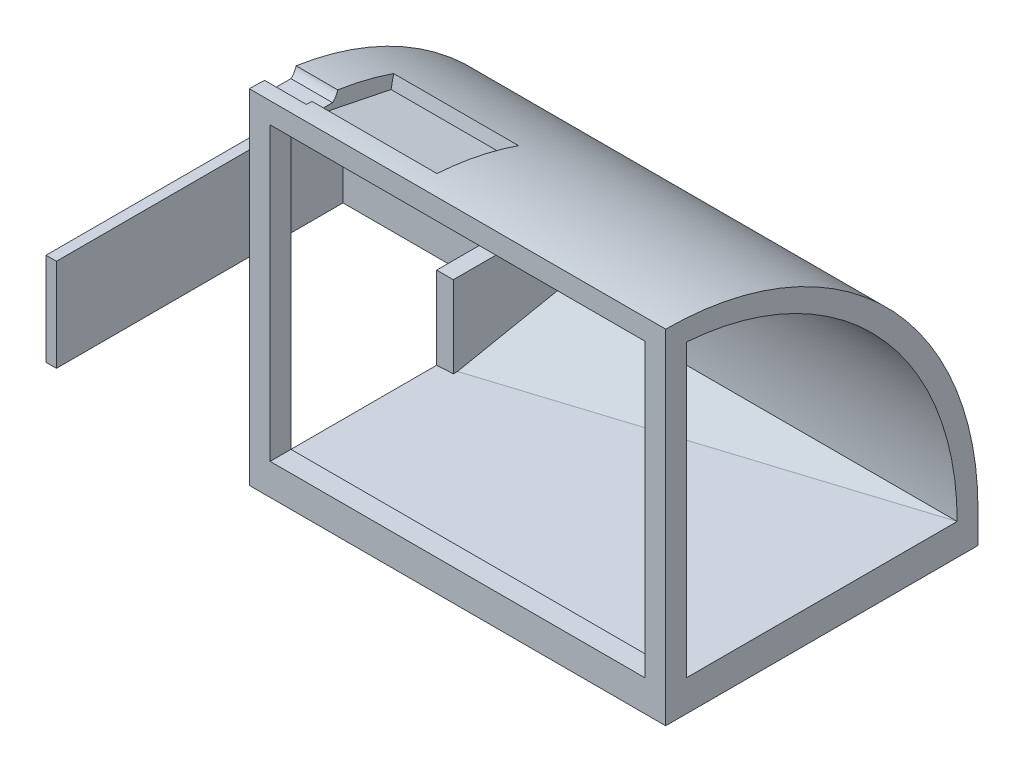
ISO-10303-21;
HEADER;
FILE_DESCRIPTION(('STEP AP214'),'2;1');
FILE_NAME('part.step','',(''),(''),'','','');
FILE_SCHEMA(('AUTOMOTIVE_DESIGN { 1 0 10303 214 1 1 1 1 }'));
ENDSEC;
DATA;
#1=APPLICATION_CONTEXT('core data for automotive mechanical design processes');
#2=APPLICATION_PROTOCOL_DEFINITION('international standard','automotive_design',2000,#1);
#3=PRODUCT_CONTEXT('',#1,'mechanical');
#4=PRODUCT('Part','Part','',(#3));
#5=PRODUCT_RELATED_PRODUCT_CATEGORY('part','',(#4));
#6=PRODUCT_DEFINITION_FORMATION('','',#4);
#7=PRODUCT_DEFINITION_CONTEXT('part definition',#1,'design');
#8=PRODUCT_DEFINITION('design','',#6,#7);
#9=PRODUCT_DEFINITION_SHAPE('','',#8);
#10=(LENGTH_UNIT() NAMED_UNIT(*) SI_UNIT(.MILLI.,.METRE.));
#11=(NAMED_UNIT(*) PLANE_ANGLE_UNIT() SI_UNIT($,.RADIAN.));
#12=(NAMED_UNIT(*) SI_UNIT($,.STERADIAN.) SOLID_ANGLE_UNIT());
#13=UNCERTAINTY_MEASURE_WITH_UNIT(LENGTH_MEASURE(1.E-05),#10,'distance_accuracy_value','');
#14=(GEOMETRIC_REPRESENTATION_CONTEXT(3) GLOBAL_UNCERTAINTY_ASSIGNED_CONTEXT((#13)) GLOBAL_UNIT_ASSIGNED_CONTEXT((#10,
#11,#12)) REPRESENTATION_CONTEXT('',''));
#15=CARTESIAN_POINT('',(0.,0.,0.));
#16=DIRECTION('',(0.,0.,1.));
#17=DIRECTION('',(1.,0.,0.));
#18=AXIS2_PLACEMENT_3D('',#15,#16,#17);
#19=CARTESIAN_POINT('',(-100.,0.,75.));
#20=DIRECTION('',(-1.,0.,0.));
#21=DIRECTION('',(0.,0.,1.));
#22=AXIS2_PLACEMENT_3D('',#19,#20,#21);
#23=CYLINDRICAL_SURFACE('',#22,140.);
#24=CARTESIAN_POINT('',(-195.,0.,75.));
#25=DIRECTION('',(-1.,0.,0.));
#26=DIRECTION('',(0.,0.,1.));
#27=AXIS2_PLACEMENT_3D('',#24,#25,#26);
#28=CIRCLE('',#27,140.);
#29=CARTESIAN_POINT('',(-195.,29.5585297831051,-61.8440474301359));
#30=VERTEX_POINT('',#29);
#31=CARTESIAN_POINT('',(-195.,0.,-65.));
#32=VERTEX_POINT('',#31);
#33=EDGE_CURVE('E434',#30,#32,#28,.T.);
#34=ORIENTED_EDGE('',*,*,#33,.T.);
#35=DIRECTION('',(1.,0.,0.));
#36=VECTOR('',#35,1.);
#37=CARTESIAN_POINT('',(-200.,0.,-65.));
#38=LINE('',#37,#36);
#39=CARTESIAN_POINT('',(-100.,0.,-65.));
#40=VERTEX_POINT('',#39);
#41=EDGE_CURVE('E215',#32,#40,#38,.T.);
#42=ORIENTED_EDGE('',*,*,#41,.T.);
#43=CARTESIAN_POINT('',(-100.,0.,75.));
#44=DIRECTION('',(-1.,0.,0.));
#45=DIRECTION('',(0.,0.,1.));
#46=AXIS2_PLACEMENT_3D('',#43,#44,#45);
#47=CIRCLE('',#46,140.);
#48=CARTESIAN_POINT('',(-100.,29.5585297831051,-61.8440474301359));
#49=VERTEX_POINT('',#48);
#50=EDGE_CURVE('E466',#49,#40,#47,.T.);
#51=ORIENTED_EDGE('',*,*,#50,.F.);
#52=DIRECTION('',(1.,0.,0.));
#53=VECTOR('',#52,1.);
#54=CARTESIAN_POINT('',(-200.,29.5585297831051,-61.8440474301359));
#55=LINE('',#54,#53);
#56=EDGE_CURVE('E230',#30,#49,#55,.T.);
#57=ORIENTED_EDGE('',*,*,#56,.F.);
#58=EDGE_LOOP('',(#34,#42,#51,#57));
#59=FACE_BOUND('',#58,.T.);
#60=ADVANCED_FACE('F211',(#59),#23,.F.);
#61=CARTESIAN_POINT('',(-200.,0.,-65.));
#62=DIRECTION('',(0.,0.,1.));
#63=DIRECTION('',(1.,0.,0.));
#64=AXIS2_PLACEMENT_3D('',#61,#62,#63);
#65=PLANE('',#64);
#66=ORIENTED_EDGE('',*,*,#41,.F.);
#67=DIRECTION('',(0.,-1.,0.));
#68=VECTOR('',#67,1.);
#69=CARTESIAN_POINT('',(-195.,0.,-65.));
#70=LINE('',#69,#68);
#71=CARTESIAN_POINT('',(-195.,-15.,-65.));
#72=VERTEX_POINT('',#71);
#73=EDGE_CURVE('E238',#32,#72,#70,.T.);
#74=ORIENTED_EDGE('',*,*,#73,.T.);
#75=DIRECTION('',(1.,0.,0.));
#76=VECTOR('',#75,1.);
#77=CARTESIAN_POINT('',(-200.,-15.,-65.));
#78=LINE('',#77,#76);
#79=CARTESIAN_POINT('',(-100.,-15.,-65.));
#80=VERTEX_POINT('',#79);
#81=EDGE_CURVE('E430',#72,#80,#78,.T.);
#82=ORIENTED_EDGE('',*,*,#81,.T.);
#83=DIRECTION('',(0.,-1.,0.));
#84=VECTOR('',#83,1.);
#85=CARTESIAN_POINT('',(-100.,0.,-65.));
#86=LINE('',#85,#84);
#87=EDGE_CURVE('E474',#40,#80,#86,.T.);
#88=ORIENTED_EDGE('',*,*,#87,.F.);
#89=EDGE_LOOP('',(#66,#74,#82,#88));
#90=FACE_BOUND('',#89,.T.);
#91=ADVANCED_FACE('F553',(#90),#65,.T.);
#92=CARTESIAN_POINT('',(-92.,0.,75.));
#93=DIRECTION('',(-1.,0.,0.));
#94=DIRECTION('',(0.,0.,1.));
#95=AXIS2_PLACEMENT_3D('',#92,#93,#94);
#96=CIRCLE('',#95,140.);
#97=CARTESIAN_POINT('',(-92.,29.5585297831051,-61.8440474301359));
#98=VERTEX_POINT('',#97);
#99=CARTESIAN_POINT('',(-92.,0.,-65.));
#100=VERTEX_POINT('',#99);
#101=EDGE_CURVE('E449',#98,#100,#96,.T.);
#102=ORIENTED_EDGE('',*,*,#101,.T.);
#103=CARTESIAN_POINT('',(-92.,0.,-65.));
#104=DIRECTION('',(1.,0.,0.));
#105=VECTOR('',#104,1.);
#106=LINE('',#103,#105);
#107=CARTESIAN_POINT('',(100.,0.,-65.));
#108=VERTEX_POINT('',#107);
#109=EDGE_CURVE('E576',#100,#108,#106,.T.);
#110=ORIENTED_EDGE('',*,*,#109,.T.);
#111=CARTESIAN_POINT('',(100.,0.,75.));
#112=DIRECTION('',(-1.,0.,0.));
#113=DIRECTION('',(0.,0.,1.));
#114=AXIS2_PLACEMENT_3D('',#111,#112,#113);
#115=CIRCLE('',#114,140.);
#116=CARTESIAN_POINT('',(100.,139.642400437689,65.));
#117=VERTEX_POINT('',#116);
#118=EDGE_CURVE('E723',#117,#108,#115,.T.);
#119=ORIENTED_EDGE('',*,*,#118,.F.);
#120=DIRECTION('',(-1.,0.,0.));
#121=VECTOR('',#120,1.);
#122=CARTESIAN_POINT('',(-100.,139.642400437689,65.));
#123=LINE('',#122,#121);
#124=CARTESIAN_POINT('',(90.,139.642400437689,65.));
#125=VERTEX_POINT('',#124);
#126=EDGE_CURVE('E682',#117,#125,#123,.T.);
#127=ORIENTED_EDGE('',*,*,#126,.T.);
#128=CARTESIAN_POINT('',(90.,0.,75.));
#129=DIRECTION('',(-1.,0.,0.));
#130=DIRECTION('',(0.,0.,1.));
#131=AXIS2_PLACEMENT_3D('',#128,#129,#130);
#132=CIRCLE('',#131,140.);
#133=CARTESIAN_POINT('',(90.,140.,75.0000000000005));
#134=VERTEX_POINT('',#133);
#135=EDGE_CURVE('E679',#134,#125,#132,.T.);
#136=ORIENTED_EDGE('',*,*,#135,.F.);
#137=DIRECTION('',(1.,0.,0.));
#138=VECTOR('',#137,1.);
#139=CARTESIAN_POINT('',(0.,140.,75.0000000000005));
#140=LINE('',#139,#138);
#141=CARTESIAN_POINT('',(-90.,140.,75.0000000000005));
#142=VERTEX_POINT('',#141);
#143=EDGE_CURVE('E705',#142,#134,#140,.T.);
#144=ORIENTED_EDGE('',*,*,#143,.F.);
#145=CARTESIAN_POINT('',(-90.,0.,75.));
#146=DIRECTION('',(-1.,0.,0.));
#147=DIRECTION('',(0.,0.,1.));
#148=AXIS2_PLACEMENT_3D('',#145,#146,#147);
#149=CIRCLE('',#148,140.);
#150=CARTESIAN_POINT('',(-90.,139.642400437689,65.0000000000001));
#151=VERTEX_POINT('',#150);
#152=EDGE_CURVE('E696',#142,#151,#149,.T.);
#153=ORIENTED_EDGE('',*,*,#152,.T.);
#154=DIRECTION('',(-1.,0.,0.));
#155=VECTOR('',#154,1.);
#156=CARTESIAN_POINT('',(-100.,139.642400437689,65.0000000000001));
#157=LINE('',#156,#155);
#158=CARTESIAN_POINT('',(-100.,139.642400437689,65.0000000000001));
#159=VERTEX_POINT('',#158);
#160=EDGE_CURVE('E701',#159,#151,#157,.F.);
#161=ORIENTED_EDGE('',*,*,#160,.F.);
#162=CARTESIAN_POINT('',(-100.,0.,75.));
#163=DIRECTION('',(-1.,0.,0.));
#164=DIRECTION('',(0.,0.,1.));
#165=AXIS2_PLACEMENT_3D('',#162,#163,#164);
#166=CIRCLE('',#165,140.);
#167=EDGE_CURVE('E713',#159,#49,#166,.T.);
#168=ORIENTED_EDGE('',*,*,#167,.T.);
#169=DIRECTION('',(-1.,0.,0.));
#170=VECTOR('',#169,1.);
#171=CARTESIAN_POINT('',(-92.,29.5585297831051,-61.8440474301359));
#172=LINE('',#171,#170);
#173=EDGE_CURVE('E461',#98,#49,#172,.T.);
#174=ORIENTED_EDGE('',*,*,#173,.F.);
#175=EDGE_LOOP('',(#102,#110,#119,#127,#136,#144,#153,#161,#168,#174));
#176=FACE_BOUND('',#175,.T.);
#177=ADVANCED_FACE('F554',(#176),#23,.F.);
#178=CARTESIAN_POINT('',(-100.,0.,-65.));
#179=DIRECTION('',(0.,-0.98058067569092,-0.196116135138184));
#180=DIRECTION('',(1.,0.,0.));
#181=AXIS2_PLACEMENT_3D('',#178,#179,#180);
#182=PLANE('',#181);
#183=DIRECTION('',(0.,-0.196116135138184,0.98058067569092));
#184=VECTOR('',#183,1.);
#185=CARTESIAN_POINT('',(-92.,-12.5,-2.49999999999998));
#186=LINE('',#185,#184);
#187=CARTESIAN_POINT('',(-92.,-9.60000000000001,-16.9999999999999));
#188=VERTEX_POINT('',#187);
#189=EDGE_CURVE('E456',#100,#188,#186,.T.);
#190=ORIENTED_EDGE('',*,*,#189,.T.);
#191=DIRECTION('',(-0.969003166223018,-0.048450158311151,0.242250791555755));
#192=VECTOR('',#191,1.);
#193=CARTESIAN_POINT('',(0.,-5.,-40.));
#194=LINE('',#193,#192);
#195=EDGE_CURVE('E509',#108,#188,#194,.T.);
#196=ORIENTED_EDGE('',*,*,#195,.F.);
#197=ORIENTED_EDGE('',*,*,#109,.F.);
#198=EDGE_LOOP('',(#190,#196,#197));
#199=FACE_BOUND('',#198,.T.);
#200=ADVANCED_FACE('F594',(#199),#182,.F.);
#201=CARTESIAN_POINT('',(-100.,0.,75.));
#202=DIRECTION('',(-1.,0.,0.));
#203=DIRECTION('',(0.,0.,1.));
#204=AXIS2_PLACEMENT_3D('',#201,#202,#203);
#205=CYLINDRICAL_SURFACE('',#204,150.);
#206=DIRECTION('',(-1.,0.,0.));
#207=VECTOR('',#206,1.);
#208=CARTESIAN_POINT('',(-90.,148.308101078321,52.5343116165472));
#209=LINE('',#208,#207);
#210=CARTESIAN_POINT('',(-80.,148.308101078321,52.5343116165472));
#211=VERTEX_POINT('',#210);
#212=CARTESIAN_POINT('',(-100.,148.308101078321,52.5343116165472));
#213=VERTEX_POINT('',#212);
#214=EDGE_CURVE('E662',#211,#213,#209,.T.);
#215=ORIENTED_EDGE('',*,*,#214,.F.);
#216=CARTESIAN_POINT('',(-80.,0.,75.));
#217=DIRECTION('',(-1.,0.,0.));
#218=DIRECTION('',(0.,0.,1.));
#219=AXIS2_PLACEMENT_3D('',#216,#217,#218);
#220=CIRCLE('',#219,150.);
#221=CARTESIAN_POINT('',(-80.,141.657131648265,25.671944563098));
#222=VERTEX_POINT('',#221);
#223=EDGE_CURVE('E746',#222,#211,#220,.F.);
#224=ORIENTED_EDGE('',*,*,#223,.F.);
#225=DIRECTION('',(-1.,0.,0.));
#226=VECTOR('',#225,1.);
#227=CARTESIAN_POINT('',(-100.,141.657131648265,25.671944563098));
#228=LINE('',#227,#226);
#229=CARTESIAN_POINT('',(-20.,141.657131648265,25.671944563098));
#230=VERTEX_POINT('',#229);
#231=EDGE_CURVE('E650',#222,#230,#228,.F.);
#232=ORIENTED_EDGE('',*,*,#231,.T.);
#233=CARTESIAN_POINT('',(-20.,0.,75.));
#234=DIRECTION('',(-1.,0.,0.));
#235=DIRECTION('',(0.,0.,1.));
#236=AXIS2_PLACEMENT_3D('',#233,#234,#235);
#237=CIRCLE('',#236,150.);
#238=CARTESIAN_POINT('',(-20.,149.657131648265,64.8637804476289));
#239=VERTEX_POINT('',#238);
#240=EDGE_CURVE('E759',#230,#239,#237,.F.);
#241=ORIENTED_EDGE('',*,*,#240,.T.);
#242=DIRECTION('',(-1.,0.,0.));
#243=VECTOR('',#242,1.);
#244=CARTESIAN_POINT('',(-100.,149.657131648265,64.8637804476289));
#245=LINE('',#244,#243);
#246=CARTESIAN_POINT('',(-80.,149.657131648265,64.8637804476289));
#247=VERTEX_POINT('',#246);
#248=EDGE_CURVE('E756',#247,#239,#245,.F.);
#249=ORIENTED_EDGE('',*,*,#248,.F.);
#250=CARTESIAN_POINT('',(-80.,0.,75.));
#251=DIRECTION('',(-1.,0.,0.));
#252=DIRECTION('',(0.,0.,1.));
#253=AXIS2_PLACEMENT_3D('',#250,#251,#252);
#254=CIRCLE('',#253,150.);
#255=CARTESIAN_POINT('',(-80.,149.819958162603,67.6528824593605));
#256=VERTEX_POINT('',#255);
#257=EDGE_CURVE('E655',#247,#256,#254,.F.);
#258=ORIENTED_EDGE('',*,*,#257,.T.);
#259=DIRECTION('',(-1.,0.,0.));
#260=VECTOR('',#259,1.);
#261=CARTESIAN_POINT('',(-90.,149.819958162603,67.6528824593605));
#262=LINE('',#261,#260);
#263=CARTESIAN_POINT('',(-100.,149.819958162603,67.6528824593605));
#264=VERTEX_POINT('',#263);
#265=EDGE_CURVE('E852',#264,#256,#262,.F.);
#266=ORIENTED_EDGE('',*,*,#265,.F.);
#267=CARTESIAN_POINT('',(-100.,0.,75.));
#268=DIRECTION('',(-1.,0.,0.));
#269=DIRECTION('',(0.,0.,1.));
#270=AXIS2_PLACEMENT_3D('',#267,#268,#269);
#271=CIRCLE('',#270,150.);
#272=CARTESIAN_POINT('',(-100.,150.,75.0000000000005));
#273=VERTEX_POINT('',#272);
#274=EDGE_CURVE('E714',#273,#264,#271,.T.);
#275=ORIENTED_EDGE('',*,*,#274,.F.);
#276=DIRECTION('',(1.,0.,0.));
#277=VECTOR('',#276,1.);
#278=CARTESIAN_POINT('',(0.,150.,75.0000000000005));
#279=LINE('',#278,#277);
#280=CARTESIAN_POINT('',(100.,150.,75.0000000000005));
#281=VERTEX_POINT('',#280);
#282=EDGE_CURVE('E709',#273,#281,#279,.T.);
#283=ORIENTED_EDGE('',*,*,#282,.T.);
#284=CARTESIAN_POINT('',(100.,0.,75.));
#285=DIRECTION('',(-1.,0.,0.));
#286=DIRECTION('',(0.,0.,1.));
#287=AXIS2_PLACEMENT_3D('',#284,#285,#286);
#288=CIRCLE('',#287,150.);
#289=CARTESIAN_POINT('',(100.,0.,-75.));
#290=VERTEX_POINT('',#289);
#291=EDGE_CURVE('E718',#281,#290,#288,.T.);
#292=ORIENTED_EDGE('',*,*,#291,.T.);
#293=DIRECTION('',(1.,0.,0.));
#294=VECTOR('',#293,1.);
#295=CARTESIAN_POINT('',(0.,0.,-75.));
#296=LINE('',#295,#294);
#297=CARTESIAN_POINT('',(-200.,0.,-75.));
#298=VERTEX_POINT('',#297);
#299=EDGE_CURVE('E516',#298,#290,#296,.T.);
#300=ORIENTED_EDGE('',*,*,#299,.F.);
#301=CARTESIAN_POINT('',(-200.,0.,75.));
#302=DIRECTION('',(-1.,0.,0.));
#303=DIRECTION('',(0.,0.,1.));
#304=AXIS2_PLACEMENT_3D('',#301,#302,#303);
#305=CIRCLE('',#304,150.);
#306=CARTESIAN_POINT('',(-200.,29.5585297831051,-72.0588090427136));
#307=VERTEX_POINT('',#306);
#308=EDGE_CURVE('E473',#307,#298,#305,.T.);
#309=ORIENTED_EDGE('',*,*,#308,.F.);
#310=DIRECTION('',(1.,0.,0.));
#311=VECTOR('',#310,1.);
#312=CARTESIAN_POINT('',(-200.,29.5585297831051,-72.0588090427136));
#313=LINE('',#312,#311);
#314=CARTESIAN_POINT('',(-100.,29.5585297831051,-72.0588090427136));
#315=VERTEX_POINT('',#314);
#316=EDGE_CURVE('E494',#307,#315,#313,.T.);
#317=ORIENTED_EDGE('',*,*,#316,.T.);
#318=EDGE_CURVE('E719',#213,#315,#271,.T.);
#319=ORIENTED_EDGE('',*,*,#318,.F.);
#320=EDGE_LOOP('',(#215,#224,#232,#241,#249,#258,#266,#275,#283,#292,#300,#309,#317,#319));
#321=FACE_BOUND('',#320,.T.);
#322=ADVANCED_FACE('F555',(#321),#205,.T.);
#323=CARTESIAN_POINT('',(0.,0.,0.));
#324=DIRECTION('',(0.,1.,0.));
#325=DIRECTION('',(0.,0.,1.));
#326=AXIS2_PLACEMENT_3D('',#323,#324,#325);
#327=PLANE('',#326);
#328=DIRECTION('',(1.,0.,0.));
#329=VECTOR('',#328,1.);
#330=CARTESIAN_POINT('',(100.,0.,65.));
#331=LINE('',#330,#329);
#332=CARTESIAN_POINT('',(-90.,0.,65.0000000000001));
#333=VERTEX_POINT('',#332);
#334=CARTESIAN_POINT('',(90.,0.,65.));
#335=VERTEX_POINT('',#334);
#336=EDGE_CURVE('E497',#333,#335,#331,.T.);
#337=ORIENTED_EDGE('',*,*,#336,.F.);
#338=DIRECTION('',(0.,0.,-1.));
#339=VECTOR('',#338,1.);
#340=CARTESIAN_POINT('',(-90.0000000000001,0.,1.24900090270331E-13));
#341=LINE('',#340,#339);
#342=CARTESIAN_POINT('',(-90.,0.,75.));
#343=VERTEX_POINT('',#342);
#344=EDGE_CURVE('E695',#343,#333,#341,.T.);
#345=ORIENTED_EDGE('',*,*,#344,.F.);
#346=DIRECTION('',(1.,0.,0.));
#347=VECTOR('',#346,1.);
#348=CARTESIAN_POINT('',(0.,0.,75.));
#349=LINE('',#348,#347);
#350=CARTESIAN_POINT('',(90.,0.,75.));
#351=VERTEX_POINT('',#350);
#352=EDGE_CURVE('E517',#343,#351,#349,.T.);
#353=ORIENTED_EDGE('',*,*,#352,.T.);
#354=DIRECTION('',(0.,0.,-1.));
#355=VECTOR('',#354,1.);
#356=CARTESIAN_POINT('',(89.9999999999999,0.,-1.2490009027033E-13));
#357=LINE('',#356,#355);
#358=EDGE_CURVE('E676',#351,#335,#357,.T.);
#359=ORIENTED_EDGE('',*,*,#358,.T.);
#360=EDGE_LOOP('',(#337,#345,#353,#359));
#361=FACE_BOUND('',#360,.T.);
#362=ADVANCED_FACE('F928',(#361),#327,.T.);
#363=CARTESIAN_POINT('',(100.,-15.,0.));
#364=DIRECTION('',(-1.,0.,0.));
#365=DIRECTION('',(0.,0.,1.));
#366=AXIS2_PLACEMENT_3D('',#363,#364,#365);
#367=PLANE('',#366);
#368=ORIENTED_EDGE('',*,*,#291,.F.);
#369=DIRECTION('',(0.,1.,0.));
#370=VECTOR('',#369,1.);
#371=CARTESIAN_POINT('',(100.,-15.,75.));
#372=LINE('',#371,#370);
#373=CARTESIAN_POINT('',(100.,-15.,75.));
#374=VERTEX_POINT('',#373);
#375=EDGE_CURVE('E749',#374,#281,#372,.T.);
#376=ORIENTED_EDGE('',*,*,#375,.F.);
#377=DIRECTION('',(0.,0.,1.));
#378=VECTOR('',#377,1.);
#379=CARTESIAN_POINT('',(100.,-15.,0.));
#380=LINE('',#379,#378);
#381=CARTESIAN_POINT('',(100.,-15.,-75.));
#382=VERTEX_POINT('',#381);
#383=EDGE_CURVE('E727',#382,#374,#380,.T.);
#384=ORIENTED_EDGE('',*,*,#383,.F.);
#385=DIRECTION('',(0.,1.,0.));
#386=VECTOR('',#385,1.);
#387=CARTESIAN_POINT('',(100.,-15.,-75.));
#388=LINE('',#387,#386);
#389=EDGE_CURVE('E737',#382,#290,#388,.T.);
#390=ORIENTED_EDGE('',*,*,#389,.T.);
#391=EDGE_LOOP('',(#368,#376,#384,#390));
#392=FACE_BOUND('',#391,.T.);
#393=DIRECTION('',(0.,0.,1.));
#394=VECTOR('',#393,1.);
#395=CARTESIAN_POINT('',(100.,0.,0.));
#396=LINE('',#395,#394);
#397=CARTESIAN_POINT('',(100.,0.,65.));
#398=VERTEX_POINT('',#397);
#399=EDGE_CURVE('E512',#108,#398,#396,.T.);
#400=ORIENTED_EDGE('',*,*,#399,.T.);
#401=DIRECTION('',(0.,-1.,0.));
#402=VECTOR('',#401,1.);
#403=CARTESIAN_POINT('',(100.,150.001,65.));
#404=LINE('',#403,#402);
#405=EDGE_CURVE('E687',#117,#398,#404,.T.);
#406=ORIENTED_EDGE('',*,*,#405,.F.);
#407=ORIENTED_EDGE('',*,*,#118,.T.);
#408=EDGE_LOOP('',(#400,#406,#407));
#409=FACE_BOUND('',#408,.T.);
#410=ADVANCED_FACE('F802',(#392,#409),#367,.F.);
#411=CARTESIAN_POINT('',(-100.,-15.,0.));
#412=DIRECTION('',(-1.,0.,0.));
#413=DIRECTION('',(0.,0.,1.));
#414=AXIS2_PLACEMENT_3D('',#411,#412,#413);
#415=PLANE('',#414);
#416=DIRECTION('',(0.,0.,-1.));
#417=VECTOR('',#416,1.);
#418=CARTESIAN_POINT('',(-100.,29.5585297831051,0.));
#419=LINE('',#418,#417);
#420=EDGE_CURVE('E485',#49,#315,#419,.T.);
#421=ORIENTED_EDGE('',*,*,#420,.F.);
#422=ORIENTED_EDGE('',*,*,#167,.F.);
#423=DIRECTION('',(0.,-1.,0.));
#424=VECTOR('',#423,1.);
#425=CARTESIAN_POINT('',(-100.,150.001,65.0000000000001));
#426=LINE('',#425,#424);
#427=CARTESIAN_POINT('',(-100.,-10.,65.0000000000001));
#428=VERTEX_POINT('',#427);
#429=EDGE_CURVE('E700',#159,#428,#426,.T.);
#430=ORIENTED_EDGE('',*,*,#429,.T.);
#431=DIRECTION('',(0.,0.,1.));
#432=VECTOR('',#431,1.);
#433=CARTESIAN_POINT('',(-100.,-10.,65.0000000000001));
#434=LINE('',#433,#432);
#435=CARTESIAN_POINT('',(-100.,-10.,-14.9999999999999));
#436=VERTEX_POINT('',#435);
#437=EDGE_CURVE('E563',#436,#428,#434,.T.);
#438=ORIENTED_EDGE('',*,*,#437,.F.);
#439=DIRECTION('',(0.,1.,0.));
#440=VECTOR('',#439,1.);
#441=CARTESIAN_POINT('',(-100.,0.,-14.9999999999999));
#442=LINE('',#441,#440);
#443=CARTESIAN_POINT('',(-100.,29.5585297831051,-14.9999999999999));
#444=VERTEX_POINT('',#443);
#445=EDGE_CURVE('E450',#436,#444,#442,.T.);
#446=ORIENTED_EDGE('',*,*,#445,.T.);
#447=DIRECTION('',(0.,0.,-1.));
#448=VECTOR('',#447,1.);
#449=CARTESIAN_POINT('',(-100.,29.5585297831051,0.));
#450=LINE('',#449,#448);
#451=EDGE_CURVE('E443',#444,#49,#450,.T.);
#452=ORIENTED_EDGE('',*,*,#451,.T.);
#453=ORIENTED_EDGE('',*,*,#50,.T.);
#454=ORIENTED_EDGE('',*,*,#87,.T.);
#455=DIRECTION('',(0.,0.,1.));
#456=VECTOR('',#455,1.);
#457=CARTESIAN_POINT('',(-100.,-15.,0.));
#458=LINE('',#457,#456);
#459=CARTESIAN_POINT('',(-100.,-15.,75.));
#460=VERTEX_POINT('',#459);
#461=EDGE_CURVE('E734',#80,#460,#458,.T.);
#462=ORIENTED_EDGE('',*,*,#461,.T.);
#463=DIRECTION('',(0.,1.,0.));
#464=VECTOR('',#463,1.);
#465=CARTESIAN_POINT('',(-100.,-15.,75.));
#466=LINE('',#465,#464);
#467=EDGE_CURVE('E740',#460,#273,#466,.T.);
#468=ORIENTED_EDGE('',*,*,#467,.T.);
#469=ORIENTED_EDGE('',*,*,#274,.T.);
#470=CARTESIAN_POINT('',(-100.,150.,60.0000000000001));
#471=DIRECTION('',(-1.,0.,0.));
#472=DIRECTION('',(0.,0.,1.));
#473=AXIS2_PLACEMENT_3D('',#470,#471,#472);
#474=CIRCLE('',#473,7.655);
#475=CARTESIAN_POINT('',(-100.,144.203533403874,65.0000000000001));
#476=VERTEX_POINT('',#475);
#477=EDGE_CURVE('E827',#476,#264,#474,.T.);
#478=ORIENTED_EDGE('',*,*,#477,.F.);
#479=DIRECTION('',(0.,0.,1.));
#480=VECTOR('',#479,1.);
#481=CARTESIAN_POINT('',(-100.,144.203533403874,0.));
#482=LINE('',#481,#480);
#483=CARTESIAN_POINT('',(-100.,144.203533403874,55.0000000000001));
#484=VERTEX_POINT('',#483);
#485=EDGE_CURVE('E834',#484,#476,#482,.T.);
#486=ORIENTED_EDGE('',*,*,#485,.F.);
#487=EDGE_CURVE('E825',#213,#484,#474,.T.);
#488=ORIENTED_EDGE('',*,*,#487,.F.);
#489=ORIENTED_EDGE('',*,*,#318,.T.);
#490=EDGE_LOOP('',(#421,#422,#430,#438,#446,#452,#453,#454,#462,#468,#469,#478,#486,#488,#489));
#491=FACE_BOUND('',#490,.T.);
#492=ADVANCED_FACE('F819',(#491),#415,.T.);
#493=CARTESIAN_POINT('',(0.,-15.,75.));
#494=DIRECTION('',(0.,0.,1.));
#495=DIRECTION('',(1.,0.,0.));
#496=AXIS2_PLACEMENT_3D('',#493,#494,#495);
#497=PLANE('',#496);
#498=ORIENTED_EDGE('',*,*,#375,.T.);
#499=ORIENTED_EDGE('',*,*,#282,.F.);
#500=ORIENTED_EDGE('',*,*,#467,.F.);
#501=DIRECTION('',(1.,0.,0.));
#502=VECTOR('',#501,1.);
#503=CARTESIAN_POINT('',(0.,-15.,75.));
#504=LINE('',#503,#502);
#505=EDGE_CURVE('E724',#460,#374,#504,.T.);
#506=ORIENTED_EDGE('',*,*,#505,.T.);
#507=EDGE_LOOP('',(#498,#499,#500,#506));
#508=FACE_BOUND('',#507,.T.);
#509=ORIENTED_EDGE('',*,*,#352,.F.);
#510=DIRECTION('',(0.,-1.,0.));
#511=VECTOR('',#510,1.);
#512=CARTESIAN_POINT('',(-90.,150.001,75.));
#513=LINE('',#512,#511);
#514=EDGE_CURVE('E691',#142,#343,#513,.T.);
#515=ORIENTED_EDGE('',*,*,#514,.F.);
#516=ORIENTED_EDGE('',*,*,#143,.T.);
#517=DIRECTION('',(0.,-1.,0.));
#518=VECTOR('',#517,1.);
#519=CARTESIAN_POINT('',(90.,150.001,75.));
#520=LINE('',#519,#518);
#521=EDGE_CURVE('E683',#134,#351,#520,.T.);
#522=ORIENTED_EDGE('',*,*,#521,.T.);
#523=EDGE_LOOP('',(#509,#515,#516,#522));
#524=FACE_BOUND('',#523,.T.);
#525=ADVANCED_FACE('F213',(#508,#524),#497,.T.);
#526=CARTESIAN_POINT('',(0.,-15.,0.));
#527=DIRECTION('',(0.,1.,0.));
#528=DIRECTION('',(0.,0.,1.));
#529=AXIS2_PLACEMENT_3D('',#526,#527,#528);
#530=PLANE('',#529);
#531=ORIENTED_EDGE('',*,*,#505,.F.);
#532=ORIENTED_EDGE('',*,*,#461,.F.);
#533=ORIENTED_EDGE('',*,*,#81,.F.);
#534=DIRECTION('',(0.,0.,1.));
#535=VECTOR('',#534,1.);
#536=CARTESIAN_POINT('',(-195.,-15.,-65.));
#537=LINE('',#536,#535);
#538=CARTESIAN_POINT('',(-195.,-15.,72.6445333836523));
#539=VERTEX_POINT('',#538);
#540=EDGE_CURVE('E409',#72,#539,#537,.T.);
#541=ORIENTED_EDGE('',*,*,#540,.T.);
#542=DIRECTION('',(-1.,0.,0.));
#543=VECTOR('',#542,1.);
#544=CARTESIAN_POINT('',(-195.,-15.,72.6445333836523));
#545=LINE('',#544,#543);
#546=CARTESIAN_POINT('',(-200.,-15.,72.6445333836523));
#547=VERTEX_POINT('',#546);
#548=EDGE_CURVE('E418',#539,#547,#545,.T.);
#549=ORIENTED_EDGE('',*,*,#548,.T.);
#550=DIRECTION('',(0.,0.,-1.));
#551=VECTOR('',#550,1.);
#552=CARTESIAN_POINT('',(-200.,-15.,0.));
#553=LINE('',#552,#551);
#554=CARTESIAN_POINT('',(-200.,-15.,-75.));
#555=VERTEX_POINT('',#554);
#556=EDGE_CURVE('E482',#547,#555,#553,.T.);
#557=ORIENTED_EDGE('',*,*,#556,.T.);
#558=DIRECTION('',(1.,0.,0.));
#559=VECTOR('',#558,1.);
#560=CARTESIAN_POINT('',(0.,-15.,-75.));
#561=LINE('',#560,#559);
#562=EDGE_CURVE('E731',#555,#382,#561,.T.);
#563=ORIENTED_EDGE('',*,*,#562,.T.);
#564=ORIENTED_EDGE('',*,*,#383,.T.);
#565=EDGE_LOOP('',(#531,#532,#533,#541,#549,#557,#563,#564));
#566=FACE_BOUND('',#565,.T.);
#567=ADVANCED_FACE('F428',(#566),#530,.F.);
#568=CARTESIAN_POINT('',(0.,-15.,-75.));
#569=DIRECTION('',(0.,0.,1.));
#570=DIRECTION('',(1.,0.,0.));
#571=AXIS2_PLACEMENT_3D('',#568,#569,#570);
#572=PLANE('',#571);
#573=ORIENTED_EDGE('',*,*,#299,.T.);
#574=ORIENTED_EDGE('',*,*,#389,.F.);
#575=ORIENTED_EDGE('',*,*,#562,.F.);
#576=DIRECTION('',(0.,1.,0.));
#577=VECTOR('',#576,1.);
#578=CARTESIAN_POINT('',(-200.,0.,-75.));
#579=LINE('',#578,#577);
#580=EDGE_CURVE('E478',#555,#298,#579,.T.);
#581=ORIENTED_EDGE('',*,*,#580,.T.);
#582=EDGE_LOOP('',(#573,#574,#575,#581));
#583=FACE_BOUND('',#582,.T.);
#584=ADVANCED_FACE('F548',(#583),#572,.F.);
#585=CARTESIAN_POINT('',(-90.0000000000001,150.001,1.24900090270331E-13));
#586=DIRECTION('',(-1.,0.,0.));
#587=DIRECTION('',(0.,0.,1.));
#588=AXIS2_PLACEMENT_3D('',#585,#586,#587);
#589=PLANE('',#588);
#590=ORIENTED_EDGE('',*,*,#152,.F.);
#591=ORIENTED_EDGE('',*,*,#514,.T.);
#592=ORIENTED_EDGE('',*,*,#344,.T.);
#593=DIRECTION('',(0.,-1.,0.));
#594=VECTOR('',#593,1.);
#595=CARTESIAN_POINT('',(-90.,150.001,65.0000000000001));
#596=LINE('',#595,#594);
#597=EDGE_CURVE('E704',#151,#333,#596,.T.);
#598=ORIENTED_EDGE('',*,*,#597,.F.);
#599=EDGE_LOOP('',(#590,#591,#592,#598));
#600=FACE_BOUND('',#599,.T.);
#601=ADVANCED_FACE('F544',(#600),#589,.F.);
#602=CARTESIAN_POINT('',(0.,150.001,65.0000000000001));
#603=DIRECTION('',(0.,0.,-1.));
#604=DIRECTION('',(-1.,0.,0.));
#605=AXIS2_PLACEMENT_3D('',#602,#603,#604);
#606=PLANE('',#605);
#607=ORIENTED_EDGE('',*,*,#429,.F.);
#608=ORIENTED_EDGE('',*,*,#160,.T.);
#609=ORIENTED_EDGE('',*,*,#597,.T.);
#610=ORIENTED_EDGE('',*,*,#336,.T.);
#611=DIRECTION('',(0.,-1.,0.));
#612=VECTOR('',#611,1.);
#613=CARTESIAN_POINT('',(90.,150.001,65.));
#614=LINE('',#613,#612);
#615=EDGE_CURVE('E789',#125,#335,#614,.T.);
#616=ORIENTED_EDGE('',*,*,#615,.F.);
#617=ORIENTED_EDGE('',*,*,#126,.F.);
#618=ORIENTED_EDGE('',*,*,#405,.T.);
#619=DIRECTION('',(0.998752338877845,0.0499376169438922,0.));
#620=VECTOR('',#619,1.);
#621=CARTESIAN_POINT('',(0.,-5.,65.0000000000001));
#622=LINE('',#621,#620);
#623=EDGE_CURVE('E505',#428,#398,#622,.T.);
#624=ORIENTED_EDGE('',*,*,#623,.F.);
#625=EDGE_LOOP('',(#607,#608,#609,#610,#616,#617,#618,#624));
#626=FACE_BOUND('',#625,.T.);
#627=ADVANCED_FACE('F533',(#626),#606,.T.);
#628=CARTESIAN_POINT('',(89.9999999999999,150.001,-1.2490009027033E-13));
#629=DIRECTION('',(-1.,0.,0.));
#630=DIRECTION('',(0.,0.,1.));
#631=AXIS2_PLACEMENT_3D('',#628,#629,#630);
#632=PLANE('',#631);
#633=ORIENTED_EDGE('',*,*,#521,.F.);
#634=ORIENTED_EDGE('',*,*,#135,.T.);
#635=ORIENTED_EDGE('',*,*,#615,.T.);
#636=ORIENTED_EDGE('',*,*,#358,.F.);
#637=EDGE_LOOP('',(#633,#634,#635,#636));
#638=FACE_BOUND('',#637,.T.);
#639=ADVANCED_FACE('F543',(#638),#632,.T.);
#640=CARTESIAN_POINT('',(-20.,18.6969384566988,91.5959179422656));
#641=DIRECTION('',(0.,0.199999999999997,0.979795897113272));
#642=DIRECTION('',(0.,-0.979795897113272,0.199999999999997));
#643=AXIS2_PLACEMENT_3D('',#640,#641,#642);
#644=PLANE('',#643);
#645=ORIENTED_EDGE('',*,*,#248,.T.);
#646=DIRECTION('',(0.,0.979795897113272,-0.199999999999997));
#647=VECTOR('',#646,1.);
#648=CARTESIAN_POINT('',(-20.,18.6969384566988,91.5959179422656));
#649=LINE('',#648,#647);
#650=CARTESIAN_POINT('',(-20.,143.620915338641,66.0959179422659));
#651=VERTEX_POINT('',#650);
#652=EDGE_CURVE('E665',#651,#239,#649,.T.);
#653=ORIENTED_EDGE('',*,*,#652,.F.);
#654=DIRECTION('',(-1.,0.,0.));
#655=VECTOR('',#654,1.);
#656=CARTESIAN_POINT('',(-20.,143.620915338641,66.0959179422659));
#657=LINE('',#656,#655);
#658=CARTESIAN_POINT('',(-80.,143.620915338641,66.0959179422659));
#659=VERTEX_POINT('',#658);
#660=EDGE_CURVE('E673',#651,#659,#657,.T.);
#661=ORIENTED_EDGE('',*,*,#660,.T.);
#662=DIRECTION('',(0.,0.979795897113272,-0.199999999999997));
#663=VECTOR('',#662,1.);
#664=CARTESIAN_POINT('',(-80.,18.6969384566988,91.5959179422656));
#665=LINE('',#664,#663);
#666=CARTESIAN_POINT('',(-80.,145.016864380401,65.8109710373294));
#667=VERTEX_POINT('',#666);
#668=EDGE_CURVE('E668',#659,#667,#665,.T.);
#669=ORIENTED_EDGE('',*,*,#668,.T.);
#670=EDGE_CURVE('E659',#667,#247,#665,.T.);
#671=ORIENTED_EDGE('',*,*,#670,.T.);
#672=EDGE_LOOP('',(#645,#653,#661,#669,#671));
#673=FACE_BOUND('',#672,.T.);
#674=ADVANCED_FACE('F630',(#673),#644,.F.);
#675=CARTESIAN_POINT('',(-20.,124.923976881942,-25.4999999999997));
#676=DIRECTION('',(0.,0.979795897113272,-0.199999999999997));
#677=DIRECTION('',(0.,0.199999999999997,0.979795897113272));
#678=AXIS2_PLACEMENT_3D('',#675,#676,#677);
#679=PLANE('',#678);
#680=DIRECTION('',(0.,-0.199999999999997,-0.979795897113272));
#681=VECTOR('',#680,1.);
#682=CARTESIAN_POINT('',(-80.,124.923976881942,-25.4999999999997));
#683=LINE('',#682,#681);
#684=CARTESIAN_POINT('',(-80.,135.620915338641,26.904082057735));
#685=VERTEX_POINT('',#684);
#686=EDGE_CURVE('E654',#659,#685,#683,.T.);
#687=ORIENTED_EDGE('',*,*,#686,.F.);
#688=ORIENTED_EDGE('',*,*,#660,.F.);
#689=DIRECTION('',(0.,-0.199999999999997,-0.979795897113272));
#690=VECTOR('',#689,1.);
#691=CARTESIAN_POINT('',(-20.,124.923976881942,-25.4999999999997));
#692=LINE('',#691,#690);
#693=CARTESIAN_POINT('',(-20.,135.620915338641,26.904082057735));
#694=VERTEX_POINT('',#693);
#695=EDGE_CURVE('E858',#651,#694,#692,.T.);
#696=ORIENTED_EDGE('',*,*,#695,.T.);
#697=DIRECTION('',(-1.,0.,0.));
#698=VECTOR('',#697,1.);
#699=CARTESIAN_POINT('',(-20.,135.620915338641,26.904082057735));
#700=LINE('',#699,#698);
#701=EDGE_CURVE('E647',#694,#685,#700,.T.);
#702=ORIENTED_EDGE('',*,*,#701,.T.);
#703=EDGE_LOOP('',(#687,#688,#696,#702));
#704=FACE_BOUND('',#703,.T.);
#705=ADVANCED_FACE('F633',(#704),#679,.T.);
#706=CARTESIAN_POINT('',(-20.,10.6969384566989,52.4040820577347));
#707=DIRECTION('',(0.,0.199999999999997,0.979795897113272));
#708=DIRECTION('',(0.,-0.979795897113272,0.199999999999997));
#709=AXIS2_PLACEMENT_3D('',#706,#707,#708);
#710=PLANE('',#709);
#711=DIRECTION('',(0.,0.979795897113272,-0.199999999999997));
#712=VECTOR('',#711,1.);
#713=CARTESIAN_POINT('',(-80.,10.6969384566989,52.4040820577347));
#714=LINE('',#713,#712);
#715=EDGE_CURVE('E644',#685,#222,#714,.T.);
#716=ORIENTED_EDGE('',*,*,#715,.F.);
#717=ORIENTED_EDGE('',*,*,#701,.F.);
#718=DIRECTION('',(0.,0.979795897113272,-0.199999999999997));
#719=VECTOR('',#718,1.);
#720=CARTESIAN_POINT('',(-20.,10.6969384566989,52.4040820577347));
#721=LINE('',#720,#719);
#722=EDGE_CURVE('E672',#694,#230,#721,.T.);
#723=ORIENTED_EDGE('',*,*,#722,.T.);
#724=ORIENTED_EDGE('',*,*,#231,.F.);
#725=EDGE_LOOP('',(#716,#717,#723,#724));
#726=FACE_BOUND('',#725,.T.);
#727=ADVANCED_FACE('F625',(#726),#710,.T.);
#728=CARTESIAN_POINT('',(-20.,0.,0.));
#729=DIRECTION('',(-1.,0.,0.));
#730=DIRECTION('',(0.,0.,1.));
#731=AXIS2_PLACEMENT_3D('',#728,#729,#730);
#732=PLANE('',#731);
#733=ORIENTED_EDGE('',*,*,#722,.F.);
#734=ORIENTED_EDGE('',*,*,#695,.F.);
#735=ORIENTED_EDGE('',*,*,#652,.T.);
#736=ORIENTED_EDGE('',*,*,#240,.F.);
#737=EDGE_LOOP('',(#733,#734,#735,#736));
#738=FACE_BOUND('',#737,.T.);
#739=ADVANCED_FACE('F621',(#738),#732,.T.);
#740=CARTESIAN_POINT('',(-80.,0.,0.));
#741=DIRECTION('',(-1.,0.,0.));
#742=DIRECTION('',(0.,0.,1.));
#743=AXIS2_PLACEMENT_3D('',#740,#741,#742);
#744=PLANE('',#743);
#745=ORIENTED_EDGE('',*,*,#223,.T.);
#746=CARTESIAN_POINT('',(-80.,150.,60.0000000000001));
#747=DIRECTION('',(-1.,0.,0.));
#748=DIRECTION('',(0.,0.,1.));
#749=AXIS2_PLACEMENT_3D('',#746,#747,#748);
#750=CIRCLE('',#749,7.655);
#751=CARTESIAN_POINT('',(-80.,144.203533403874,55.0000000000001));
#752=VERTEX_POINT('',#751);
#753=EDGE_CURVE('E837',#752,#211,#750,.F.);
#754=ORIENTED_EDGE('',*,*,#753,.F.);
#755=DIRECTION('',(0.,0.,-1.));
#756=VECTOR('',#755,1.);
#757=CARTESIAN_POINT('',(-80.,144.203533403874,0.));
#758=LINE('',#757,#756);
#759=CARTESIAN_POINT('',(-80.,144.203533403874,65.0000000000001));
#760=VERTEX_POINT('',#759);
#761=EDGE_CURVE('E849',#760,#752,#758,.T.);
#762=ORIENTED_EDGE('',*,*,#761,.F.);
#763=CARTESIAN_POINT('',(-80.,150.,60.0000000000001));
#764=DIRECTION('',(-1.,0.,0.));
#765=DIRECTION('',(0.,0.,1.));
#766=AXIS2_PLACEMENT_3D('',#763,#764,#765);
#767=CIRCLE('',#766,7.655);
#768=EDGE_CURVE('E763',#760,#667,#767,.T.);
#769=ORIENTED_EDGE('',*,*,#768,.T.);
#770=ORIENTED_EDGE('',*,*,#668,.F.);
#771=ORIENTED_EDGE('',*,*,#686,.T.);
#772=ORIENTED_EDGE('',*,*,#715,.T.);
#773=EDGE_LOOP('',(#745,#754,#762,#769,#770,#771,#772));
#774=FACE_BOUND('',#773,.T.);
#775=ADVANCED_FACE('F624',(#774),#744,.F.);
#776=CARTESIAN_POINT('',(-59.6201557025898,150.,60.0000000000001));
#777=DIRECTION('',(-1.,0.,0.));
#778=DIRECTION('',(0.,0.,1.));
#779=AXIS2_PLACEMENT_3D('',#776,#777,#778);
#780=CYLINDRICAL_SURFACE('',#779,7.655);
#781=ORIENTED_EDGE('',*,*,#214,.T.);
#782=ORIENTED_EDGE('',*,*,#487,.T.);
#783=DIRECTION('',(-1.,0.,0.));
#784=VECTOR('',#783,1.);
#785=CARTESIAN_POINT('',(-59.6201557025898,144.203533403874,55.0000000000001));
#786=LINE('',#785,#784);
#787=EDGE_CURVE('E842',#752,#484,#786,.T.);
#788=ORIENTED_EDGE('',*,*,#787,.F.);
#789=ORIENTED_EDGE('',*,*,#753,.T.);
#790=EDGE_LOOP('',(#781,#782,#788,#789));
#791=FACE_BOUND('',#790,.T.);
#792=ADVANCED_FACE('F619',(#791),#780,.F.);
#793=ORIENTED_EDGE('',*,*,#265,.T.);
#794=EDGE_CURVE('E846',#256,#667,#750,.F.);
#795=ORIENTED_EDGE('',*,*,#794,.T.);
#796=ORIENTED_EDGE('',*,*,#768,.F.);
#797=DIRECTION('',(-1.,0.,0.));
#798=VECTOR('',#797,1.);
#799=CARTESIAN_POINT('',(-59.6201557025898,144.203533403874,65.));
#800=LINE('',#799,#798);
#801=EDGE_CURVE('E843',#760,#476,#800,.T.);
#802=ORIENTED_EDGE('',*,*,#801,.T.);
#803=ORIENTED_EDGE('',*,*,#477,.T.);
#804=EDGE_LOOP('',(#793,#795,#796,#802,#803));
#805=FACE_BOUND('',#804,.T.);
#806=ADVANCED_FACE('F615',(#805),#780,.F.);
#807=CARTESIAN_POINT('',(-59.6201557025898,144.203533403874,0.));
#808=DIRECTION('',(0.,-1.,0.));
#809=DIRECTION('',(0.,0.,-1.));
#810=AXIS2_PLACEMENT_3D('',#807,#808,#809);
#811=PLANE('',#810);
#812=ORIENTED_EDGE('',*,*,#761,.T.);
#813=ORIENTED_EDGE('',*,*,#787,.T.);
#814=ORIENTED_EDGE('',*,*,#485,.T.);
#815=ORIENTED_EDGE('',*,*,#801,.F.);
#816=EDGE_LOOP('',(#812,#813,#814,#815));
#817=FACE_BOUND('',#816,.T.);
#818=ADVANCED_FACE('F611',(#817),#811,.F.);
#819=CARTESIAN_POINT('',(-80.,0.,0.));
#820=DIRECTION('',(-1.,0.,0.));
#821=DIRECTION('',(0.,0.,1.));
#822=AXIS2_PLACEMENT_3D('',#819,#820,#821);
#823=PLANE('',#822);
#824=ORIENTED_EDGE('',*,*,#670,.F.);
#825=ORIENTED_EDGE('',*,*,#794,.F.);
#826=ORIENTED_EDGE('',*,*,#257,.F.);
#827=EDGE_LOOP('',(#824,#825,#826));
#828=FACE_BOUND('',#827,.T.);
#829=ADVANCED_FACE('F607',(#828),#823,.T.);
#830=CARTESIAN_POINT('',(0.249376558603492,-4.98753117206983,0.));
#831=DIRECTION('',(-0.0499376169438922,0.998752338877845,0.));
#832=DIRECTION('',(-0.998752338877845,-0.0499376169438922,0.));
#833=AXIS2_PLACEMENT_3D('',#830,#831,#832);
#834=PLANE('',#833);
#835=DIRECTION('',(0.998752338877845,0.0499376169438922,0.));
#836=VECTOR('',#835,1.);
#837=CARTESIAN_POINT('',(0.249376558603489,-4.98753117206984,-14.9999999999999));
#838=LINE('',#837,#836);
#839=CARTESIAN_POINT('',(-92.,-9.60000000000001,-14.9999999999999));
#840=VERTEX_POINT('',#839);
#841=EDGE_CURVE('E12',#436,#840,#838,.T.);
#842=ORIENTED_EDGE('',*,*,#841,.F.);
#843=ORIENTED_EDGE('',*,*,#437,.T.);
#844=ORIENTED_EDGE('',*,*,#623,.T.);
#845=ORIENTED_EDGE('',*,*,#399,.F.);
#846=ORIENTED_EDGE('',*,*,#195,.T.);
#847=DIRECTION('',(0.,0.,1.));
#848=VECTOR('',#847,1.);
#849=CARTESIAN_POINT('',(-92.,-9.60000000000001,0.));
#850=LINE('',#849,#848);
#851=EDGE_CURVE('E222',#188,#840,#850,.T.);
#852=ORIENTED_EDGE('',*,*,#851,.T.);
#853=EDGE_LOOP('',(#842,#843,#844,#845,#846,#852));
#854=FACE_BOUND('',#853,.T.);
#855=ADVANCED_FACE('F604',(#854),#834,.T.);
#856=CARTESIAN_POINT('',(-200.,29.5585297831051,0.));
#857=DIRECTION('',(0.,-1.,0.));
#858=DIRECTION('',(0.,0.,-1.));
#859=AXIS2_PLACEMENT_3D('',#856,#857,#858);
#860=PLANE('',#859);
#861=ORIENTED_EDGE('',*,*,#420,.T.);
#862=ORIENTED_EDGE('',*,*,#316,.F.);
#863=DIRECTION('',(0.,0.,-1.));
#864=VECTOR('',#863,1.);
#865=CARTESIAN_POINT('',(-200.,29.5585297831051,0.));
#866=LINE('',#865,#864);
#867=CARTESIAN_POINT('',(-200.,29.5585297831051,72.6445333836523));
#868=VERTEX_POINT('',#867);
#869=EDGE_CURVE('E469',#868,#307,#866,.T.);
#870=ORIENTED_EDGE('',*,*,#869,.F.);
#871=DIRECTION('',(-1.,0.,0.));
#872=VECTOR('',#871,1.);
#873=CARTESIAN_POINT('',(-195.,29.5585297831051,72.6445333836523));
#874=LINE('',#873,#872);
#875=CARTESIAN_POINT('',(-195.,29.5585297831051,72.6445333836523));
#876=VERTEX_POINT('',#875);
#877=EDGE_CURVE('E425',#876,#868,#874,.T.);
#878=ORIENTED_EDGE('',*,*,#877,.F.);
#879=DIRECTION('',(0.,0.,1.));
#880=VECTOR('',#879,1.);
#881=CARTESIAN_POINT('',(-195.,29.5585297831051,-61.8440474301359));
#882=LINE('',#881,#880);
#883=EDGE_CURVE('E410',#30,#876,#882,.T.);
#884=ORIENTED_EDGE('',*,*,#883,.F.);
#885=ORIENTED_EDGE('',*,*,#56,.T.);
#886=EDGE_LOOP('',(#861,#862,#870,#878,#884,#885));
#887=FACE_BOUND('',#886,.T.);
#888=ADVANCED_FACE('F899',(#887),#860,.F.);
#889=CARTESIAN_POINT('',(-200.,0.,0.));
#890=DIRECTION('',(-1.,0.,0.));
#891=DIRECTION('',(0.,0.,1.));
#892=AXIS2_PLACEMENT_3D('',#889,#890,#891);
#893=PLANE('',#892);
#894=ORIENTED_EDGE('',*,*,#869,.T.);
#895=ORIENTED_EDGE('',*,*,#308,.T.);
#896=ORIENTED_EDGE('',*,*,#580,.F.);
#897=ORIENTED_EDGE('',*,*,#556,.F.);
#898=DIRECTION('',(0.,-1.,0.));
#899=VECTOR('',#898,1.);
#900=CARTESIAN_POINT('',(-200.,29.5585297831051,72.6445333836523));
#901=LINE('',#900,#899);
#902=EDGE_CURVE('E421',#868,#547,#901,.T.);
#903=ORIENTED_EDGE('',*,*,#902,.F.);
#904=EDGE_LOOP('',(#894,#895,#896,#897,#903));
#905=FACE_BOUND('',#904,.T.);
#906=ADVANCED_FACE('F895',(#905),#893,.T.);
#907=CARTESIAN_POINT('',(-92.,29.5585297831051,0.));
#908=DIRECTION('',(0.,1.,0.));
#909=DIRECTION('',(0.,0.,1.));
#910=AXIS2_PLACEMENT_3D('',#907,#908,#909);
#911=PLANE('',#910);
#912=ORIENTED_EDGE('',*,*,#451,.F.);
#913=DIRECTION('',(-1.,0.,0.));
#914=VECTOR('',#913,1.);
#915=CARTESIAN_POINT('',(-92.,29.5585297831051,-14.9999999999999));
#916=LINE('',#915,#914);
#917=CARTESIAN_POINT('',(-92.,29.5585297831051,-14.9999999999999));
#918=VERTEX_POINT('',#917);
#919=EDGE_CURVE('E489',#918,#444,#916,.T.);
#920=ORIENTED_EDGE('',*,*,#919,.F.);
#921=DIRECTION('',(0.,0.,-1.));
#922=VECTOR('',#921,1.);
#923=CARTESIAN_POINT('',(-92.,29.5585297831051,0.));
#924=LINE('',#923,#922);
#925=EDGE_CURVE('E445',#918,#98,#924,.T.);
#926=ORIENTED_EDGE('',*,*,#925,.T.);
#927=ORIENTED_EDGE('',*,*,#173,.T.);
#928=EDGE_LOOP('',(#912,#920,#926,#927));
#929=FACE_BOUND('',#928,.T.);
#930=ADVANCED_FACE('F1003',(#929),#911,.T.);
#931=CARTESIAN_POINT('',(-92.,0.,-14.9999999999999));
#932=DIRECTION('',(0.,0.,1.));
#933=DIRECTION('',(1.,0.,0.));
#934=AXIS2_PLACEMENT_3D('',#931,#932,#933);
#935=PLANE('',#934);
#936=ORIENTED_EDGE('',*,*,#445,.F.);
#937=ORIENTED_EDGE('',*,*,#841,.T.);
#938=DIRECTION('',(0.,1.,0.));
#939=VECTOR('',#938,1.);
#940=CARTESIAN_POINT('',(-92.,0.,-14.9999999999999));
#941=LINE('',#940,#939);
#942=EDGE_CURVE('E453',#840,#918,#941,.T.);
#943=ORIENTED_EDGE('',*,*,#942,.T.);
#944=ORIENTED_EDGE('',*,*,#919,.T.);
#945=EDGE_LOOP('',(#936,#937,#943,#944));
#946=FACE_BOUND('',#945,.T.);
#947=ADVANCED_FACE('F1006',(#946),#935,.T.);
#948=CARTESIAN_POINT('',(-92.,0.,0.));
#949=DIRECTION('',(-1.,0.,0.));
#950=DIRECTION('',(0.,0.,1.));
#951=AXIS2_PLACEMENT_3D('',#948,#949,#950);
#952=PLANE('',#951);
#953=ORIENTED_EDGE('',*,*,#851,.F.);
#954=ORIENTED_EDGE('',*,*,#189,.F.);
#955=ORIENTED_EDGE('',*,*,#101,.F.);
#956=ORIENTED_EDGE('',*,*,#925,.F.);
#957=ORIENTED_EDGE('',*,*,#942,.F.);
#958=EDGE_LOOP('',(#953,#954,#955,#956,#957));
#959=FACE_BOUND('',#958,.T.);
#960=ADVANCED_FACE('F1015',(#959),#952,.F.);
#961=CARTESIAN_POINT('',(-195.,29.5585297831051,72.6445333836523));
#962=DIRECTION('',(0.,0.,-1.));
#963=DIRECTION('',(-1.,0.,0.));
#964=AXIS2_PLACEMENT_3D('',#961,#962,#963);
#965=PLANE('',#964);
#966=ORIENTED_EDGE('',*,*,#902,.T.);
#967=ORIENTED_EDGE('',*,*,#548,.F.);
#968=DIRECTION('',(0.,-1.,0.));
#969=VECTOR('',#968,1.);
#970=CARTESIAN_POINT('',(-195.,29.5585297831051,72.6445333836523));
#971=LINE('',#970,#969);
#972=EDGE_CURVE('E404',#876,#539,#971,.T.);
#973=ORIENTED_EDGE('',*,*,#972,.F.);
#974=ORIENTED_EDGE('',*,*,#877,.T.);
#975=EDGE_LOOP('',(#966,#967,#973,#974));
#976=FACE_BOUND('',#975,.T.);
#977=ADVANCED_FACE('F419',(#976),#965,.F.);
#978=CARTESIAN_POINT('',(-195.,0.,75.));
#979=DIRECTION('',(-1.,0.,0.));
#980=DIRECTION('',(0.,0.,1.));
#981=AXIS2_PLACEMENT_3D('',#978,#979,#980);
#982=PLANE('',#981);
#983=ORIENTED_EDGE('',*,*,#33,.F.);
#984=ORIENTED_EDGE('',*,*,#883,.T.);
#985=ORIENTED_EDGE('',*,*,#972,.T.);
#986=ORIENTED_EDGE('',*,*,#540,.F.);
#987=ORIENTED_EDGE('',*,*,#73,.F.);
#988=EDGE_LOOP('',(#983,#984,#985,#986,#987));
#989=FACE_BOUND('',#988,.T.);
#990=ADVANCED_FACE('F407',(#989),#982,.F.);
#991=CLOSED_SHELL('',(#60,#91,#177,#200,#322,#362,#410,#492,#525,#567,#584,#601,#627,#639,#674,
#705,#727,#739,#775,#792,#806,#818,#829,#855,#888,#906,#930,#947,#960,#977,#990));
#992=MANIFOLD_SOLID_BREP('B2',#991);
#993=ADVANCED_BREP_SHAPE_REPRESENTATION('',(#18,#992),#14);
#994=SHAPE_DEFINITION_REPRESENTATION(#9,#993);
ENDSEC;
END-ISO-10303-21;
